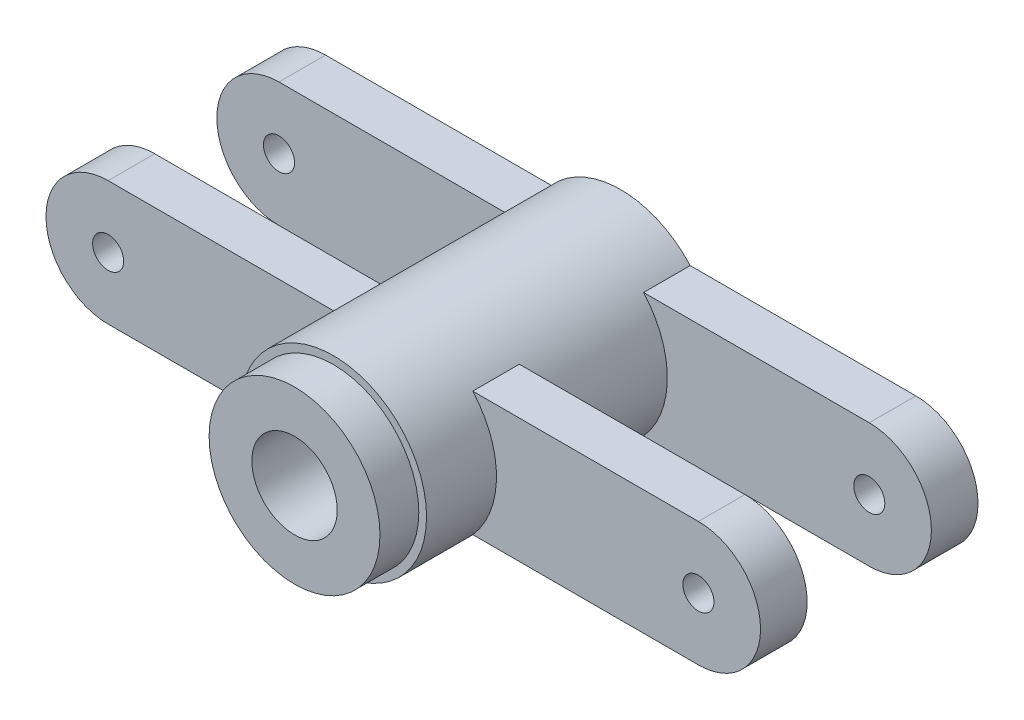
ISO-10303-21;
HEADER;
FILE_DESCRIPTION(('STEP AP214'),'2;1');
FILE_NAME('part.step','',(''),(''),'','','');
FILE_SCHEMA(('AUTOMOTIVE_DESIGN { 1 0 10303 214 1 1 1 1 }'));
ENDSEC;
DATA;
#1=APPLICATION_CONTEXT('core data for automotive mechanical design processes');
#2=APPLICATION_PROTOCOL_DEFINITION('international standard','automotive_design',2000,#1);
#3=PRODUCT_CONTEXT('',#1,'mechanical');
#4=PRODUCT('Part','Part','',(#3));
#5=PRODUCT_RELATED_PRODUCT_CATEGORY('part','',(#4));
#6=PRODUCT_DEFINITION_FORMATION('','',#4);
#7=PRODUCT_DEFINITION_CONTEXT('part definition',#1,'design');
#8=PRODUCT_DEFINITION('design','',#6,#7);
#9=PRODUCT_DEFINITION_SHAPE('','',#8);
#10=(LENGTH_UNIT() NAMED_UNIT(*) SI_UNIT(.MILLI.,.METRE.));
#11=(NAMED_UNIT(*) PLANE_ANGLE_UNIT() SI_UNIT($,.RADIAN.));
#12=(NAMED_UNIT(*) SI_UNIT($,.STERADIAN.) SOLID_ANGLE_UNIT());
#13=UNCERTAINTY_MEASURE_WITH_UNIT(LENGTH_MEASURE(1.E-05),#10,'distance_accuracy_value','');
#14=(GEOMETRIC_REPRESENTATION_CONTEXT(3) GLOBAL_UNCERTAINTY_ASSIGNED_CONTEXT((#13)) GLOBAL_UNIT_ASSIGNED_CONTEXT((#10,
#11,#12)) REPRESENTATION_CONTEXT('',''));
#15=CARTESIAN_POINT('',(0.,0.,0.));
#16=DIRECTION('',(0.,0.,1.));
#17=DIRECTION('',(1.,0.,0.));
#18=AXIS2_PLACEMENT_3D('',#15,#16,#17);
#19=CARTESIAN_POINT('',(0.,0.,21.));
#20=DIRECTION('',(0.,0.,-1.));
#21=DIRECTION('',(-1.,0.,0.));
#22=AXIS2_PLACEMENT_3D('',#19,#20,#21);
#23=CYLINDRICAL_SURFACE('',#22,1.5);
#24=CARTESIAN_POINT('',(0.,0.,0.));
#25=DIRECTION('',(0.,0.,-1.));
#26=DIRECTION('',(-1.,0.,0.));
#27=AXIS2_PLACEMENT_3D('',#24,#25,#26);
#28=CIRCLE('',#27,1.5);
#29=CARTESIAN_POINT('',(-1.5,0.,0.));
#30=VERTEX_POINT('',#29);
#31=EDGE_CURVE('E157',#30,#30,#28,.T.);
#32=ORIENTED_EDGE('',*,*,#31,.T.);
#33=EDGE_LOOP('',(#32));
#34=FACE_BOUND('',#33,.T.);
#35=CARTESIAN_POINT('',(0.,0.,16.));
#36=DIRECTION('',(0.,0.,1.));
#37=DIRECTION('',(1.,0.,0.));
#38=AXIS2_PLACEMENT_3D('',#35,#36,#37);
#39=CIRCLE('',#38,1.5);
#40=CARTESIAN_POINT('',(1.5,0.,16.));
#41=VERTEX_POINT('',#40);
#42=EDGE_CURVE('E38',#41,#41,#39,.F.);
#43=ORIENTED_EDGE('',*,*,#42,.F.);
#44=EDGE_LOOP('',(#43));
#45=FACE_BOUND('',#44,.T.);
#46=ADVANCED_FACE('F34',(#34,#45),#23,.F.);
#47=CARTESIAN_POINT('',(0.,0.,11.));
#48=DIRECTION('',(0.,0.,-1.));
#49=DIRECTION('',(-1.,0.,0.));
#50=AXIS2_PLACEMENT_3D('',#47,#48,#49);
#51=CYLINDRICAL_SURFACE('',#50,6.);
#52=DIRECTION('',(0.,0.,-1.));
#53=VECTOR('',#52,1.);
#54=CARTESIAN_POINT('',(-4.47213595499958,-4.,11.));
#55=LINE('',#54,#53);
#56=CARTESIAN_POINT('',(-4.47213595499958,-4.,0.));
#57=VERTEX_POINT('',#56);
#58=CARTESIAN_POINT('',(-4.47213595499958,-4.,3.));
#59=VERTEX_POINT('',#58);
#60=EDGE_CURVE('E237',#57,#59,#55,.F.);
#61=ORIENTED_EDGE('',*,*,#60,.F.);
#62=CARTESIAN_POINT('',(0.,0.,0.));
#63=DIRECTION('',(0.,0.,1.));
#64=DIRECTION('',(1.,0.,0.));
#65=AXIS2_PLACEMENT_3D('',#62,#63,#64);
#66=CIRCLE('',#65,6.);
#67=CARTESIAN_POINT('',(4.47213595499958,-4.,0.));
#68=VERTEX_POINT('',#67);
#69=EDGE_CURVE('E241',#57,#68,#66,.T.);
#70=ORIENTED_EDGE('',*,*,#69,.T.);
#71=DIRECTION('',(0.,0.,-1.));
#72=VECTOR('',#71,1.);
#73=CARTESIAN_POINT('',(4.47213595499958,-4.,11.));
#74=LINE('',#73,#72);
#75=CARTESIAN_POINT('',(4.47213595499958,-4.,3.));
#76=VERTEX_POINT('',#75);
#77=EDGE_CURVE('E239',#76,#68,#74,.T.);
#78=ORIENTED_EDGE('',*,*,#77,.F.);
#79=CARTESIAN_POINT('',(0.,0.,3.));
#80=DIRECTION('',(0.,0.,1.));
#81=DIRECTION('',(1.,0.,0.));
#82=AXIS2_PLACEMENT_3D('',#79,#80,#81);
#83=CIRCLE('',#82,6.);
#84=CARTESIAN_POINT('',(4.47213595499958,4.,3.));
#85=VERTEX_POINT('',#84);
#86=EDGE_CURVE('E244',#76,#85,#83,.T.);
#87=ORIENTED_EDGE('',*,*,#86,.T.);
#88=DIRECTION('',(0.,0.,-1.));
#89=VECTOR('',#88,1.);
#90=CARTESIAN_POINT('',(4.47213595499958,4.,11.));
#91=LINE('',#90,#89);
#92=CARTESIAN_POINT('',(4.47213595499958,4.,0.));
#93=VERTEX_POINT('',#92);
#94=EDGE_CURVE('E231',#93,#85,#91,.F.);
#95=ORIENTED_EDGE('',*,*,#94,.F.);
#96=CARTESIAN_POINT('',(-4.47213595499958,4.,0.));
#97=VERTEX_POINT('',#96);
#98=EDGE_CURVE('E166',#93,#97,#66,.T.);
#99=ORIENTED_EDGE('',*,*,#98,.T.);
#100=DIRECTION('',(0.,0.,-1.));
#101=VECTOR('',#100,1.);
#102=CARTESIAN_POINT('',(-4.47213595499958,4.,11.));
#103=LINE('',#102,#101);
#104=CARTESIAN_POINT('',(-4.47213595499958,4.,3.));
#105=VERTEX_POINT('',#104);
#106=EDGE_CURVE('E234',#105,#97,#103,.T.);
#107=ORIENTED_EDGE('',*,*,#106,.F.);
#108=EDGE_CURVE('E59',#105,#59,#83,.T.);
#109=ORIENTED_EDGE('',*,*,#108,.T.);
#110=EDGE_LOOP('',(#61,#70,#78,#87,#95,#99,#107,#109));
#111=FACE_BOUND('',#110,.T.);
#112=DIRECTION('',(0.,0.,-1.));
#113=VECTOR('',#112,1.);
#114=CARTESIAN_POINT('',(4.47213595499958,4.,21.));
#115=LINE('',#114,#113);
#116=CARTESIAN_POINT('',(4.47213595499958,4.,14.));
#117=VERTEX_POINT('',#116);
#118=CARTESIAN_POINT('',(4.47213595499958,4.,11.));
#119=VERTEX_POINT('',#118);
#120=EDGE_CURVE('E148',#117,#119,#115,.T.);
#121=ORIENTED_EDGE('',*,*,#120,.T.);
#122=CARTESIAN_POINT('',(0.,0.,11.));
#123=DIRECTION('',(0.,0.,1.));
#124=DIRECTION('',(1.,0.,0.));
#125=AXIS2_PLACEMENT_3D('',#122,#123,#124);
#126=CIRCLE('',#125,6.);
#127=CARTESIAN_POINT('',(4.47213595499958,-4.,11.));
#128=VERTEX_POINT('',#127);
#129=EDGE_CURVE('E151',#128,#119,#126,.T.);
#130=ORIENTED_EDGE('',*,*,#129,.F.);
#131=DIRECTION('',(0.,0.,-1.));
#132=VECTOR('',#131,1.);
#133=CARTESIAN_POINT('',(4.47213595499958,-4.,21.));
#134=LINE('',#133,#132);
#135=CARTESIAN_POINT('',(4.47213595499958,-4.,14.));
#136=VERTEX_POINT('',#135);
#137=EDGE_CURVE('E51',#128,#136,#134,.F.);
#138=ORIENTED_EDGE('',*,*,#137,.T.);
#139=CARTESIAN_POINT('',(0.,0.,14.));
#140=DIRECTION('',(0.,0.,1.));
#141=DIRECTION('',(1.,0.,0.));
#142=AXIS2_PLACEMENT_3D('',#139,#140,#141);
#143=CIRCLE('',#142,6.);
#144=EDGE_CURVE('E43',#117,#136,#143,.F.);
#145=ORIENTED_EDGE('',*,*,#144,.F.);
#146=EDGE_LOOP('',(#121,#130,#138,#145));
#147=FACE_BOUND('',#146,.T.);
#148=CARTESIAN_POINT('',(-4.47213595499958,4.,11.));
#149=VERTEX_POINT('',#148);
#150=CARTESIAN_POINT('',(-4.47213595499958,-4.,11.));
#151=VERTEX_POINT('',#150);
#152=EDGE_CURVE('E165',#149,#151,#126,.T.);
#153=ORIENTED_EDGE('',*,*,#152,.F.);
#154=DIRECTION('',(0.,0.,-1.));
#155=VECTOR('',#154,1.);
#156=CARTESIAN_POINT('',(-4.47213595499958,4.,21.));
#157=LINE('',#156,#155);
#158=CARTESIAN_POINT('',(-4.47213595499958,4.,14.));
#159=VERTEX_POINT('',#158);
#160=EDGE_CURVE('E276',#149,#159,#157,.F.);
#161=ORIENTED_EDGE('',*,*,#160,.T.);
#162=CARTESIAN_POINT('',(-4.47213595499958,-4.,14.));
#163=VERTEX_POINT('',#162);
#164=EDGE_CURVE('E11',#163,#159,#143,.F.);
#165=ORIENTED_EDGE('',*,*,#164,.F.);
#166=DIRECTION('',(0.,0.,-1.));
#167=VECTOR('',#166,1.);
#168=CARTESIAN_POINT('',(-4.47213595499958,-4.,21.));
#169=LINE('',#168,#167);
#170=EDGE_CURVE('E278',#163,#151,#169,.T.);
#171=ORIENTED_EDGE('',*,*,#170,.T.);
#172=EDGE_LOOP('',(#153,#161,#165,#171));
#173=FACE_BOUND('',#172,.T.);
#174=CARTESIAN_POINT('',(0.,0.,18.5));
#175=DIRECTION('',(0.,0.,1.));
#176=DIRECTION('',(1.,0.,0.));
#177=AXIS2_PLACEMENT_3D('',#174,#175,#176);
#178=CIRCLE('',#177,6.);
#179=CARTESIAN_POINT('',(6.,0.,18.5));
#180=VERTEX_POINT('',#179);
#181=EDGE_CURVE('E268',#180,#180,#178,.T.);
#182=ORIENTED_EDGE('',*,*,#181,.F.);
#183=EDGE_LOOP('',(#182));
#184=FACE_BOUND('',#183,.T.);
#185=ADVANCED_FACE('F36',(#111,#147,#173,#184),#51,.T.);
#186=CARTESIAN_POINT('',(0.,0.,21.));
#187=DIRECTION('',(0.,0.,1.));
#188=DIRECTION('',(1.,0.,0.));
#189=AXIS2_PLACEMENT_3D('',#186,#187,#188);
#190=PLANE('',#189);
#191=CARTESIAN_POINT('',(0.,0.,21.));
#192=DIRECTION('',(0.,0.,1.));
#193=DIRECTION('',(1.,0.,0.));
#194=AXIS2_PLACEMENT_3D('',#191,#192,#193);
#195=CIRCLE('',#194,2.75);
#196=CARTESIAN_POINT('',(2.75,0.,21.));
#197=VERTEX_POINT('',#196);
#198=EDGE_CURVE('E345',#197,#197,#195,.T.);
#199=ORIENTED_EDGE('',*,*,#198,.F.);
#200=EDGE_LOOP('',(#199));
#201=FACE_BOUND('',#200,.T.);
#202=CARTESIAN_POINT('',(0.,0.,21.));
#203=DIRECTION('',(0.,0.,1.));
#204=DIRECTION('',(1.,0.,0.));
#205=AXIS2_PLACEMENT_3D('',#202,#203,#204);
#206=CIRCLE('',#205,5.5);
#207=CARTESIAN_POINT('',(5.5,0.,21.));
#208=VERTEX_POINT('',#207);
#209=EDGE_CURVE('E252',#208,#208,#206,.T.);
#210=ORIENTED_EDGE('',*,*,#209,.T.);
#211=EDGE_LOOP('',(#210));
#212=FACE_BOUND('',#211,.T.);
#213=ADVANCED_FACE('F332',(#201,#212),#190,.T.);
#214=CARTESIAN_POINT('',(-19.,-4.,14.));
#215=DIRECTION('',(0.,1.,0.));
#216=DIRECTION('',(-1.,0.,0.));
#217=AXIS2_PLACEMENT_3D('',#214,#215,#216);
#218=PLANE('',#217);
#219=ORIENTED_EDGE('',*,*,#137,.F.);
#220=DIRECTION('',(1.,0.,0.));
#221=VECTOR('',#220,1.);
#222=CARTESIAN_POINT('',(-19.,-4.,11.));
#223=LINE('',#222,#221);
#224=CARTESIAN_POINT('',(19.,-4.,11.));
#225=VERTEX_POINT('',#224);
#226=EDGE_CURVE('E164',#128,#225,#223,.T.);
#227=ORIENTED_EDGE('',*,*,#226,.T.);
#228=DIRECTION('',(0.,0.,-1.));
#229=VECTOR('',#228,1.);
#230=CARTESIAN_POINT('',(19.,-4.,14.));
#231=LINE('',#230,#229);
#232=CARTESIAN_POINT('',(19.,-4.,14.));
#233=VERTEX_POINT('',#232);
#234=EDGE_CURVE('E187',#233,#225,#231,.T.);
#235=ORIENTED_EDGE('',*,*,#234,.F.);
#236=DIRECTION('',(1.,0.,0.));
#237=VECTOR('',#236,1.);
#238=CARTESIAN_POINT('',(-19.,-4.,14.));
#239=LINE('',#238,#237);
#240=EDGE_CURVE('E176',#136,#233,#239,.T.);
#241=ORIENTED_EDGE('',*,*,#240,.F.);
#242=EDGE_LOOP('',(#219,#227,#235,#241));
#243=FACE_BOUND('',#242,.T.);
#244=ADVANCED_FACE('F295',(#243),#218,.F.);
#245=ORIENTED_EDGE('',*,*,#170,.F.);
#246=CARTESIAN_POINT('',(-19.,-4.,14.));
#247=VERTEX_POINT('',#246);
#248=EDGE_CURVE('E281',#247,#163,#239,.T.);
#249=ORIENTED_EDGE('',*,*,#248,.F.);
#250=DIRECTION('',(0.,0.,-1.));
#251=VECTOR('',#250,1.);
#252=CARTESIAN_POINT('',(-19.,-4.,14.));
#253=LINE('',#252,#251);
#254=CARTESIAN_POINT('',(-19.,-4.,11.));
#255=VERTEX_POINT('',#254);
#256=EDGE_CURVE('E190',#247,#255,#253,.T.);
#257=ORIENTED_EDGE('',*,*,#256,.T.);
#258=EDGE_CURVE('E289',#255,#151,#223,.T.);
#259=ORIENTED_EDGE('',*,*,#258,.T.);
#260=EDGE_LOOP('',(#245,#249,#257,#259));
#261=FACE_BOUND('',#260,.T.);
#262=ADVANCED_FACE('F340',(#261),#218,.F.);
#263=CARTESIAN_POINT('',(-19.,4.,14.));
#264=DIRECTION('',(0.,-1.,0.));
#265=DIRECTION('',(1.,0.,0.));
#266=AXIS2_PLACEMENT_3D('',#263,#264,#265);
#267=PLANE('',#266);
#268=ORIENTED_EDGE('',*,*,#160,.F.);
#269=DIRECTION('',(-1.,0.,0.));
#270=VECTOR('',#269,1.);
#271=CARTESIAN_POINT('',(-19.,4.,11.));
#272=LINE('',#271,#270);
#273=CARTESIAN_POINT('',(-19.,4.,11.));
#274=VERTEX_POINT('',#273);
#275=EDGE_CURVE('E173',#149,#274,#272,.T.);
#276=ORIENTED_EDGE('',*,*,#275,.T.);
#277=DIRECTION('',(0.,0.,-1.));
#278=VECTOR('',#277,1.);
#279=CARTESIAN_POINT('',(-19.,4.,14.));
#280=LINE('',#279,#278);
#281=CARTESIAN_POINT('',(-19.,4.,14.));
#282=VERTEX_POINT('',#281);
#283=EDGE_CURVE('E182',#282,#274,#280,.T.);
#284=ORIENTED_EDGE('',*,*,#283,.F.);
#285=DIRECTION('',(-1.,0.,0.));
#286=VECTOR('',#285,1.);
#287=CARTESIAN_POINT('',(-19.,4.,14.));
#288=LINE('',#287,#286);
#289=EDGE_CURVE('E286',#159,#282,#288,.T.);
#290=ORIENTED_EDGE('',*,*,#289,.F.);
#291=EDGE_LOOP('',(#268,#276,#284,#290));
#292=FACE_BOUND('',#291,.T.);
#293=ADVANCED_FACE('F465',(#292),#267,.F.);
#294=ORIENTED_EDGE('',*,*,#120,.F.);
#295=CARTESIAN_POINT('',(19.,4.,14.));
#296=VERTEX_POINT('',#295);
#297=EDGE_CURVE('E185',#296,#117,#288,.T.);
#298=ORIENTED_EDGE('',*,*,#297,.F.);
#299=DIRECTION('',(0.,0.,-1.));
#300=VECTOR('',#299,1.);
#301=CARTESIAN_POINT('',(19.,4.,14.));
#302=LINE('',#301,#300);
#303=CARTESIAN_POINT('',(19.,4.,11.));
#304=VERTEX_POINT('',#303);
#305=EDGE_CURVE('E171',#296,#304,#302,.T.);
#306=ORIENTED_EDGE('',*,*,#305,.T.);
#307=EDGE_CURVE('E163',#304,#119,#272,.T.);
#308=ORIENTED_EDGE('',*,*,#307,.T.);
#309=EDGE_LOOP('',(#294,#298,#306,#308));
#310=FACE_BOUND('',#309,.T.);
#311=ADVANCED_FACE('F169',(#310),#267,.F.);
#312=CARTESIAN_POINT('',(-19.,0.,14.));
#313=DIRECTION('',(0.,0.,1.));
#314=DIRECTION('',(1.,0.,0.));
#315=AXIS2_PLACEMENT_3D('',#312,#313,#314);
#316=PLANE('',#315);
#317=CARTESIAN_POINT('',(-19.,0.,14.));
#318=DIRECTION('',(0.,0.,1.));
#319=DIRECTION('',(1.,0.,0.));
#320=AXIS2_PLACEMENT_3D('',#317,#318,#319);
#321=CIRCLE('',#320,1.);
#322=CARTESIAN_POINT('',(-18.,0.,14.));
#323=VERTEX_POINT('',#322);
#324=EDGE_CURVE('E255',#323,#323,#321,.T.);
#325=ORIENTED_EDGE('',*,*,#324,.F.);
#326=EDGE_LOOP('',(#325));
#327=FACE_BOUND('',#326,.T.);
#328=ORIENTED_EDGE('',*,*,#248,.T.);
#329=ORIENTED_EDGE('',*,*,#164,.T.);
#330=ORIENTED_EDGE('',*,*,#289,.T.);
#331=CARTESIAN_POINT('',(-19.,0.,14.));
#332=DIRECTION('',(0.,0.,1.));
#333=DIRECTION('',(1.,0.,0.));
#334=AXIS2_PLACEMENT_3D('',#331,#332,#333);
#335=CIRCLE('',#334,4.);
#336=EDGE_CURVE('E172',#282,#247,#335,.T.);
#337=ORIENTED_EDGE('',*,*,#336,.T.);
#338=EDGE_LOOP('',(#328,#329,#330,#337));
#339=FACE_BOUND('',#338,.T.);
#340=ADVANCED_FACE('F306',(#327,#339),#316,.T.);
#341=CARTESIAN_POINT('',(0.,0.,0.));
#342=DIRECTION('',(0.,0.,1.));
#343=DIRECTION('',(1.,0.,0.));
#344=AXIS2_PLACEMENT_3D('',#341,#342,#343);
#345=PLANE('',#344);
#346=CARTESIAN_POINT('',(19.,0.,0.));
#347=DIRECTION('',(0.,0.,1.));
#348=DIRECTION('',(1.,0.,0.));
#349=AXIS2_PLACEMENT_3D('',#346,#347,#348);
#350=CIRCLE('',#349,1.);
#351=CARTESIAN_POINT('',(20.,0.,0.));
#352=VERTEX_POINT('',#351);
#353=EDGE_CURVE('E381',#352,#352,#350,.T.);
#354=ORIENTED_EDGE('',*,*,#353,.T.);
#355=EDGE_LOOP('',(#354));
#356=FACE_BOUND('',#355,.T.);
#357=CARTESIAN_POINT('',(-19.,0.,0.));
#358=DIRECTION('',(0.,0.,1.));
#359=DIRECTION('',(1.,0.,0.));
#360=AXIS2_PLACEMENT_3D('',#357,#358,#359);
#361=CIRCLE('',#360,1.);
#362=CARTESIAN_POINT('',(-18.,0.,0.));
#363=VERTEX_POINT('',#362);
#364=EDGE_CURVE('E248',#363,#363,#361,.T.);
#365=ORIENTED_EDGE('',*,*,#364,.T.);
#366=EDGE_LOOP('',(#365));
#367=FACE_BOUND('',#366,.T.);
#368=ORIENTED_EDGE('',*,*,#31,.F.);
#369=EDGE_LOOP('',(#368));
#370=FACE_BOUND('',#369,.T.);
#371=ORIENTED_EDGE('',*,*,#98,.F.);
#372=DIRECTION('',(-1.,0.,0.));
#373=VECTOR('',#372,1.);
#374=CARTESIAN_POINT('',(-19.,4.,0.));
#375=LINE('',#374,#373);
#376=CARTESIAN_POINT('',(19.,4.,0.));
#377=VERTEX_POINT('',#376);
#378=EDGE_CURVE('E198',#377,#93,#375,.T.);
#379=ORIENTED_EDGE('',*,*,#378,.F.);
#380=CARTESIAN_POINT('',(19.,0.,0.));
#381=DIRECTION('',(0.,0.,1.));
#382=DIRECTION('',(1.,0.,0.));
#383=AXIS2_PLACEMENT_3D('',#380,#381,#382);
#384=CIRCLE('',#383,4.);
#385=CARTESIAN_POINT('',(19.,-4.,0.));
#386=VERTEX_POINT('',#385);
#387=EDGE_CURVE('E215',#386,#377,#384,.T.);
#388=ORIENTED_EDGE('',*,*,#387,.F.);
#389=DIRECTION('',(1.,0.,0.));
#390=VECTOR('',#389,1.);
#391=CARTESIAN_POINT('',(-19.,-4.,0.));
#392=LINE('',#391,#390);
#393=EDGE_CURVE('E211',#68,#386,#392,.T.);
#394=ORIENTED_EDGE('',*,*,#393,.F.);
#395=ORIENTED_EDGE('',*,*,#69,.F.);
#396=CARTESIAN_POINT('',(-19.,-4.,0.));
#397=VERTEX_POINT('',#396);
#398=EDGE_CURVE('E212',#397,#57,#392,.T.);
#399=ORIENTED_EDGE('',*,*,#398,.F.);
#400=CARTESIAN_POINT('',(-19.,0.,0.));
#401=DIRECTION('',(0.,0.,1.));
#402=DIRECTION('',(1.,0.,0.));
#403=AXIS2_PLACEMENT_3D('',#400,#401,#402);
#404=CIRCLE('',#403,4.);
#405=CARTESIAN_POINT('',(-19.,4.,0.));
#406=VERTEX_POINT('',#405);
#407=EDGE_CURVE('E193',#406,#397,#404,.T.);
#408=ORIENTED_EDGE('',*,*,#407,.F.);
#409=EDGE_CURVE('E217',#97,#406,#375,.T.);
#410=ORIENTED_EDGE('',*,*,#409,.F.);
#411=EDGE_LOOP('',(#371,#379,#388,#394,#395,#399,#408,#410));
#412=FACE_BOUND('',#411,.T.);
#413=ADVANCED_FACE('F322',(#356,#367,#370,#412),#345,.F.);
#414=CARTESIAN_POINT('',(19.,0.,3.));
#415=DIRECTION('',(0.,0.,-1.));
#416=DIRECTION('',(-1.,0.,0.));
#417=AXIS2_PLACEMENT_3D('',#414,#415,#416);
#418=CYLINDRICAL_SURFACE('',#417,4.);
#419=ORIENTED_EDGE('',*,*,#387,.T.);
#420=DIRECTION('',(0.,0.,-1.));
#421=VECTOR('',#420,1.);
#422=CARTESIAN_POINT('',(19.,4.,3.));
#423=LINE('',#422,#421);
#424=CARTESIAN_POINT('',(19.,4.,3.));
#425=VERTEX_POINT('',#424);
#426=EDGE_CURVE('E222',#425,#377,#423,.T.);
#427=ORIENTED_EDGE('',*,*,#426,.F.);
#428=CARTESIAN_POINT('',(19.,0.,3.));
#429=DIRECTION('',(0.,0.,1.));
#430=DIRECTION('',(1.,0.,0.));
#431=AXIS2_PLACEMENT_3D('',#428,#429,#430);
#432=CIRCLE('',#431,4.);
#433=CARTESIAN_POINT('',(19.,-4.,3.));
#434=VERTEX_POINT('',#433);
#435=EDGE_CURVE('E202',#434,#425,#432,.T.);
#436=ORIENTED_EDGE('',*,*,#435,.F.);
#437=DIRECTION('',(0.,0.,-1.));
#438=VECTOR('',#437,1.);
#439=CARTESIAN_POINT('',(19.,-4.,3.));
#440=LINE('',#439,#438);
#441=EDGE_CURVE('E225',#434,#386,#440,.T.);
#442=ORIENTED_EDGE('',*,*,#441,.T.);
#443=EDGE_LOOP('',(#419,#427,#436,#442));
#444=FACE_BOUND('',#443,.T.);
#445=ADVANCED_FACE('F399',(#444),#418,.T.);
#446=CARTESIAN_POINT('',(-19.,0.,3.));
#447=DIRECTION('',(0.,0.,1.));
#448=DIRECTION('',(1.,0.,0.));
#449=AXIS2_PLACEMENT_3D('',#446,#447,#448);
#450=PLANE('',#449);
#451=CARTESIAN_POINT('',(19.,0.,3.));
#452=DIRECTION('',(0.,0.,1.));
#453=DIRECTION('',(1.,0.,0.));
#454=AXIS2_PLACEMENT_3D('',#451,#452,#453);
#455=CIRCLE('',#454,1.);
#456=CARTESIAN_POINT('',(20.,0.,3.));
#457=VERTEX_POINT('',#456);
#458=EDGE_CURVE('E260',#457,#457,#455,.T.);
#459=ORIENTED_EDGE('',*,*,#458,.F.);
#460=EDGE_LOOP('',(#459));
#461=FACE_BOUND('',#460,.T.);
#462=ORIENTED_EDGE('',*,*,#86,.F.);
#463=DIRECTION('',(1.,0.,0.));
#464=VECTOR('',#463,1.);
#465=CARTESIAN_POINT('',(-19.,-4.,3.));
#466=LINE('',#465,#464);
#467=EDGE_CURVE('E197',#76,#434,#466,.T.);
#468=ORIENTED_EDGE('',*,*,#467,.T.);
#469=ORIENTED_EDGE('',*,*,#435,.T.);
#470=DIRECTION('',(-1.,0.,0.));
#471=VECTOR('',#470,1.);
#472=CARTESIAN_POINT('',(-19.,4.,3.));
#473=LINE('',#472,#471);
#474=EDGE_CURVE('E205',#425,#85,#473,.T.);
#475=ORIENTED_EDGE('',*,*,#474,.T.);
#476=EDGE_LOOP('',(#462,#468,#469,#475));
#477=FACE_BOUND('',#476,.T.);
#478=ADVANCED_FACE('F395',(#461,#477),#450,.T.);
#479=CARTESIAN_POINT('',(-19.,4.,3.));
#480=DIRECTION('',(0.,-1.,0.));
#481=DIRECTION('',(1.,0.,0.));
#482=AXIS2_PLACEMENT_3D('',#479,#480,#481);
#483=PLANE('',#482);
#484=ORIENTED_EDGE('',*,*,#378,.T.);
#485=ORIENTED_EDGE('',*,*,#94,.T.);
#486=ORIENTED_EDGE('',*,*,#474,.F.);
#487=ORIENTED_EDGE('',*,*,#426,.T.);
#488=EDGE_LOOP('',(#484,#485,#486,#487));
#489=FACE_BOUND('',#488,.T.);
#490=ADVANCED_FACE('F398',(#489),#483,.F.);
#491=CARTESIAN_POINT('',(-19.,-4.,3.));
#492=DIRECTION('',(0.,1.,0.));
#493=DIRECTION('',(-1.,0.,0.));
#494=AXIS2_PLACEMENT_3D('',#491,#492,#493);
#495=PLANE('',#494);
#496=ORIENTED_EDGE('',*,*,#467,.F.);
#497=ORIENTED_EDGE('',*,*,#77,.T.);
#498=ORIENTED_EDGE('',*,*,#393,.T.);
#499=ORIENTED_EDGE('',*,*,#441,.F.);
#500=EDGE_LOOP('',(#496,#497,#498,#499));
#501=FACE_BOUND('',#500,.T.);
#502=ADVANCED_FACE('F408',(#501),#495,.F.);
#503=CARTESIAN_POINT('',(-19.,0.,3.));
#504=DIRECTION('',(0.,0.,1.));
#505=DIRECTION('',(1.,0.,0.));
#506=AXIS2_PLACEMENT_3D('',#503,#504,#505);
#507=CIRCLE('',#506,1.);
#508=CARTESIAN_POINT('',(-18.,0.,3.));
#509=VERTEX_POINT('',#508);
#510=EDGE_CURVE('E247',#509,#509,#507,.T.);
#511=ORIENTED_EDGE('',*,*,#510,.F.);
#512=EDGE_LOOP('',(#511));
#513=FACE_BOUND('',#512,.T.);
#514=ORIENTED_EDGE('',*,*,#108,.F.);
#515=CARTESIAN_POINT('',(-19.,4.,3.));
#516=VERTEX_POINT('',#515);
#517=EDGE_CURVE('E204',#105,#516,#473,.T.);
#518=ORIENTED_EDGE('',*,*,#517,.T.);
#519=CARTESIAN_POINT('',(-19.,0.,3.));
#520=DIRECTION('',(0.,0.,1.));
#521=DIRECTION('',(1.,0.,0.));
#522=AXIS2_PLACEMENT_3D('',#519,#520,#521);
#523=CIRCLE('',#522,4.);
#524=CARTESIAN_POINT('',(-19.,-4.,3.));
#525=VERTEX_POINT('',#524);
#526=EDGE_CURVE('E194',#516,#525,#523,.T.);
#527=ORIENTED_EDGE('',*,*,#526,.T.);
#528=EDGE_CURVE('E199',#525,#59,#466,.T.);
#529=ORIENTED_EDGE('',*,*,#528,.T.);
#530=EDGE_LOOP('',(#514,#518,#527,#529));
#531=FACE_BOUND('',#530,.T.);
#532=ADVANCED_FACE('F401',(#513,#531),#450,.T.);
#533=ORIENTED_EDGE('',*,*,#398,.T.);
#534=ORIENTED_EDGE('',*,*,#60,.T.);
#535=ORIENTED_EDGE('',*,*,#528,.F.);
#536=DIRECTION('',(0.,0.,-1.));
#537=VECTOR('',#536,1.);
#538=CARTESIAN_POINT('',(-19.,-4.,3.));
#539=LINE('',#538,#537);
#540=EDGE_CURVE('E228',#525,#397,#539,.T.);
#541=ORIENTED_EDGE('',*,*,#540,.T.);
#542=EDGE_LOOP('',(#533,#534,#535,#541));
#543=FACE_BOUND('',#542,.T.);
#544=ADVANCED_FACE('F429',(#543),#495,.F.);
#545=ORIENTED_EDGE('',*,*,#517,.F.);
#546=ORIENTED_EDGE('',*,*,#106,.T.);
#547=ORIENTED_EDGE('',*,*,#409,.T.);
#548=DIRECTION('',(0.,0.,-1.));
#549=VECTOR('',#548,1.);
#550=CARTESIAN_POINT('',(-19.,4.,3.));
#551=LINE('',#550,#549);
#552=EDGE_CURVE('E208',#516,#406,#551,.T.);
#553=ORIENTED_EDGE('',*,*,#552,.F.);
#554=EDGE_LOOP('',(#545,#546,#547,#553));
#555=FACE_BOUND('',#554,.T.);
#556=ADVANCED_FACE('F420',(#555),#483,.F.);
#557=CARTESIAN_POINT('',(-19.,0.,3.));
#558=DIRECTION('',(0.,0.,-1.));
#559=DIRECTION('',(-1.,0.,0.));
#560=AXIS2_PLACEMENT_3D('',#557,#558,#559);
#561=CYLINDRICAL_SURFACE('',#560,4.);
#562=ORIENTED_EDGE('',*,*,#407,.T.);
#563=ORIENTED_EDGE('',*,*,#540,.F.);
#564=ORIENTED_EDGE('',*,*,#526,.F.);
#565=ORIENTED_EDGE('',*,*,#552,.T.);
#566=EDGE_LOOP('',(#562,#563,#564,#565));
#567=FACE_BOUND('',#566,.T.);
#568=ADVANCED_FACE('F425',(#567),#561,.T.);
#569=CARTESIAN_POINT('',(-19.,0.,11.));
#570=DIRECTION('',(0.,0.,1.));
#571=DIRECTION('',(1.,0.,0.));
#572=AXIS2_PLACEMENT_3D('',#569,#570,#571);
#573=PLANE('',#572);
#574=CARTESIAN_POINT('',(-19.,0.,11.));
#575=DIRECTION('',(0.,0.,1.));
#576=DIRECTION('',(1.,0.,0.));
#577=AXIS2_PLACEMENT_3D('',#574,#575,#576);
#578=CIRCLE('',#577,1.);
#579=CARTESIAN_POINT('',(-18.,0.,11.));
#580=VERTEX_POINT('',#579);
#581=EDGE_CURVE('E245',#580,#580,#578,.T.);
#582=ORIENTED_EDGE('',*,*,#581,.T.);
#583=EDGE_LOOP('',(#582));
#584=FACE_BOUND('',#583,.T.);
#585=ORIENTED_EDGE('',*,*,#275,.F.);
#586=ORIENTED_EDGE('',*,*,#152,.T.);
#587=ORIENTED_EDGE('',*,*,#258,.F.);
#588=CARTESIAN_POINT('',(-19.,0.,11.));
#589=DIRECTION('',(0.,0.,1.));
#590=DIRECTION('',(1.,0.,0.));
#591=AXIS2_PLACEMENT_3D('',#588,#589,#590);
#592=CIRCLE('',#591,4.);
#593=EDGE_CURVE('E279',#274,#255,#592,.T.);
#594=ORIENTED_EDGE('',*,*,#593,.F.);
#595=EDGE_LOOP('',(#585,#586,#587,#594));
#596=FACE_BOUND('',#595,.T.);
#597=ADVANCED_FACE('F457',(#584,#596),#573,.F.);
#598=CARTESIAN_POINT('',(19.,0.,11.));
#599=DIRECTION('',(0.,0.,1.));
#600=DIRECTION('',(1.,0.,0.));
#601=AXIS2_PLACEMENT_3D('',#598,#599,#600);
#602=CIRCLE('',#601,1.);
#603=CARTESIAN_POINT('',(20.,0.,11.));
#604=VERTEX_POINT('',#603);
#605=EDGE_CURVE('E387',#604,#604,#602,.T.);
#606=ORIENTED_EDGE('',*,*,#605,.T.);
#607=EDGE_LOOP('',(#606));
#608=FACE_BOUND('',#607,.T.);
#609=ORIENTED_EDGE('',*,*,#226,.F.);
#610=ORIENTED_EDGE('',*,*,#129,.T.);
#611=ORIENTED_EDGE('',*,*,#307,.F.);
#612=CARTESIAN_POINT('',(19.,0.,11.));
#613=DIRECTION('',(0.,0.,1.));
#614=DIRECTION('',(1.,0.,0.));
#615=AXIS2_PLACEMENT_3D('',#612,#613,#614);
#616=CIRCLE('',#615,4.);
#617=EDGE_CURVE('E178',#225,#304,#616,.T.);
#618=ORIENTED_EDGE('',*,*,#617,.F.);
#619=EDGE_LOOP('',(#609,#610,#611,#618));
#620=FACE_BOUND('',#619,.T.);
#621=ADVANCED_FACE('F161',(#608,#620),#573,.F.);
#622=CARTESIAN_POINT('',(-19.,0.,14.));
#623=DIRECTION('',(0.,0.,-1.));
#624=DIRECTION('',(-1.,0.,0.));
#625=AXIS2_PLACEMENT_3D('',#622,#623,#624);
#626=CYLINDRICAL_SURFACE('',#625,4.);
#627=ORIENTED_EDGE('',*,*,#593,.T.);
#628=ORIENTED_EDGE('',*,*,#256,.F.);
#629=ORIENTED_EDGE('',*,*,#336,.F.);
#630=ORIENTED_EDGE('',*,*,#283,.T.);
#631=EDGE_LOOP('',(#627,#628,#629,#630));
#632=FACE_BOUND('',#631,.T.);
#633=ADVANCED_FACE('F316',(#632),#626,.T.);
#634=CARTESIAN_POINT('',(19.,0.,14.));
#635=DIRECTION('',(0.,0.,-1.));
#636=DIRECTION('',(-1.,0.,0.));
#637=AXIS2_PLACEMENT_3D('',#634,#635,#636);
#638=CYLINDRICAL_SURFACE('',#637,4.);
#639=ORIENTED_EDGE('',*,*,#617,.T.);
#640=ORIENTED_EDGE('',*,*,#305,.F.);
#641=CARTESIAN_POINT('',(19.,0.,14.));
#642=DIRECTION('',(0.,0.,1.));
#643=DIRECTION('',(1.,0.,0.));
#644=AXIS2_PLACEMENT_3D('',#641,#642,#643);
#645=CIRCLE('',#644,4.);
#646=EDGE_CURVE('E284',#233,#296,#645,.T.);
#647=ORIENTED_EDGE('',*,*,#646,.F.);
#648=ORIENTED_EDGE('',*,*,#234,.T.);
#649=EDGE_LOOP('',(#639,#640,#647,#648));
#650=FACE_BOUND('',#649,.T.);
#651=ADVANCED_FACE('F299',(#650),#638,.T.);
#652=CARTESIAN_POINT('',(19.,0.,14.));
#653=DIRECTION('',(0.,0.,1.));
#654=DIRECTION('',(1.,0.,0.));
#655=AXIS2_PLACEMENT_3D('',#652,#653,#654);
#656=CIRCLE('',#655,1.);
#657=CARTESIAN_POINT('',(20.,0.,14.));
#658=VERTEX_POINT('',#657);
#659=EDGE_CURVE('E379',#658,#658,#656,.T.);
#660=ORIENTED_EDGE('',*,*,#659,.F.);
#661=EDGE_LOOP('',(#660));
#662=FACE_BOUND('',#661,.T.);
#663=ORIENTED_EDGE('',*,*,#297,.T.);
#664=ORIENTED_EDGE('',*,*,#144,.T.);
#665=ORIENTED_EDGE('',*,*,#240,.T.);
#666=ORIENTED_EDGE('',*,*,#646,.T.);
#667=EDGE_LOOP('',(#663,#664,#665,#666));
#668=FACE_BOUND('',#667,.T.);
#669=ADVANCED_FACE('F301',(#662,#668),#316,.T.);
#670=CARTESIAN_POINT('',(0.,0.,18.5));
#671=DIRECTION('',(0.,0.,1.));
#672=DIRECTION('',(1.,0.,0.));
#673=AXIS2_PLACEMENT_3D('',#670,#671,#672);
#674=PLANE('',#673);
#675=CARTESIAN_POINT('',(0.,0.,18.5));
#676=DIRECTION('',(0.,0.,1.));
#677=DIRECTION('',(1.,0.,0.));
#678=AXIS2_PLACEMENT_3D('',#675,#676,#677);
#679=CIRCLE('',#678,5.5);
#680=CARTESIAN_POINT('',(5.5,0.,18.5));
#681=VERTEX_POINT('',#680);
#682=EDGE_CURVE('E265',#681,#681,#679,.T.);
#683=ORIENTED_EDGE('',*,*,#682,.F.);
#684=EDGE_LOOP('',(#683));
#685=FACE_BOUND('',#684,.T.);
#686=ORIENTED_EDGE('',*,*,#181,.T.);
#687=EDGE_LOOP('',(#686));
#688=FACE_BOUND('',#687,.T.);
#689=ADVANCED_FACE('F303',(#685,#688),#674,.T.);
#690=CARTESIAN_POINT('',(0.,0.,18.5));
#691=DIRECTION('',(0.,0.,1.));
#692=DIRECTION('',(1.,0.,0.));
#693=AXIS2_PLACEMENT_3D('',#690,#691,#692);
#694=CYLINDRICAL_SURFACE('',#693,5.5);
#695=ORIENTED_EDGE('',*,*,#682,.T.);
#696=EDGE_LOOP('',(#695));
#697=FACE_BOUND('',#696,.T.);
#698=ORIENTED_EDGE('',*,*,#209,.F.);
#699=EDGE_LOOP('',(#698));
#700=FACE_BOUND('',#699,.T.);
#701=ADVANCED_FACE('F312',(#697,#700),#694,.T.);
#702=CARTESIAN_POINT('',(-19.,0.,0.));
#703=DIRECTION('',(0.,0.,1.));
#704=DIRECTION('',(1.,0.,0.));
#705=AXIS2_PLACEMENT_3D('',#702,#703,#704);
#706=CYLINDRICAL_SURFACE('',#705,1.);
#707=CARTESIAN_POINT('',(-18.,0.,14.));
#708=CARTESIAN_POINT('',(-18.,0.,13.96875));
#709=CARTESIAN_POINT('',(-18.,0.,13.9375));
#710=CARTESIAN_POINT('',(-18.,0.,13.875));
#711=CARTESIAN_POINT('',(-18.,0.,13.84375));
#712=CARTESIAN_POINT('',(-18.,0.,13.78125));
#713=CARTESIAN_POINT('',(-18.,0.,13.75));
#714=CARTESIAN_POINT('',(-18.,0.,13.6875));
#715=CARTESIAN_POINT('',(-18.,0.,13.65625));
#716=CARTESIAN_POINT('',(-18.,0.,13.59375));
#717=CARTESIAN_POINT('',(-18.,0.,13.5625));
#718=CARTESIAN_POINT('',(-18.,0.,13.5));
#719=CARTESIAN_POINT('',(-18.,0.,13.46875));
#720=CARTESIAN_POINT('',(-18.,0.,13.40625));
#721=CARTESIAN_POINT('',(-18.,0.,13.375));
#722=CARTESIAN_POINT('',(-18.,0.,13.3125));
#723=CARTESIAN_POINT('',(-18.,0.,13.28125));
#724=CARTESIAN_POINT('',(-18.,0.,13.21875));
#725=CARTESIAN_POINT('',(-18.,0.,13.1875));
#726=CARTESIAN_POINT('',(-18.,0.,13.125));
#727=CARTESIAN_POINT('',(-18.,0.,13.09375));
#728=CARTESIAN_POINT('',(-18.,0.,13.03125));
#729=CARTESIAN_POINT('',(-18.,0.,13.));
#730=CARTESIAN_POINT('',(-18.,0.,12.9375));
#731=CARTESIAN_POINT('',(-18.,0.,12.90625));
#732=CARTESIAN_POINT('',(-18.,0.,12.84375));
#733=CARTESIAN_POINT('',(-18.,0.,12.8125));
#734=CARTESIAN_POINT('',(-18.,0.,12.75));
#735=CARTESIAN_POINT('',(-18.,0.,12.71875));
#736=CARTESIAN_POINT('',(-18.,0.,12.65625));
#737=CARTESIAN_POINT('',(-18.,0.,12.625));
#738=CARTESIAN_POINT('',(-18.,0.,12.5625));
#739=CARTESIAN_POINT('',(-18.,0.,12.53125));
#740=CARTESIAN_POINT('',(-18.,0.,12.46875));
#741=CARTESIAN_POINT('',(-18.,0.,12.4375));
#742=CARTESIAN_POINT('',(-18.,0.,12.375));
#743=CARTESIAN_POINT('',(-18.,0.,12.34375));
#744=CARTESIAN_POINT('',(-18.,0.,12.28125));
#745=CARTESIAN_POINT('',(-18.,0.,12.25));
#746=CARTESIAN_POINT('',(-18.,0.,12.1875));
#747=CARTESIAN_POINT('',(-18.,0.,12.15625));
#748=CARTESIAN_POINT('',(-18.,0.,12.09375));
#749=CARTESIAN_POINT('',(-18.,0.,12.0625));
#750=CARTESIAN_POINT('',(-18.,0.,12.));
#751=CARTESIAN_POINT('',(-18.,0.,11.96875));
#752=CARTESIAN_POINT('',(-18.,0.,11.90625));
#753=CARTESIAN_POINT('',(-18.,0.,11.875));
#754=CARTESIAN_POINT('',(-18.,0.,11.8125));
#755=CARTESIAN_POINT('',(-18.,0.,11.78125));
#756=CARTESIAN_POINT('',(-18.,0.,11.71875));
#757=CARTESIAN_POINT('',(-18.,0.,11.6875));
#758=CARTESIAN_POINT('',(-18.,0.,11.625));
#759=CARTESIAN_POINT('',(-18.,0.,11.59375));
#760=CARTESIAN_POINT('',(-18.,0.,11.53125));
#761=CARTESIAN_POINT('',(-18.,0.,11.5));
#762=CARTESIAN_POINT('',(-18.,0.,11.4375));
#763=CARTESIAN_POINT('',(-18.,0.,11.40625));
#764=CARTESIAN_POINT('',(-18.,0.,11.34375));
#765=CARTESIAN_POINT('',(-18.,0.,11.3125));
#766=CARTESIAN_POINT('',(-18.,0.,11.25));
#767=CARTESIAN_POINT('',(-18.,0.,11.21875));
#768=CARTESIAN_POINT('',(-18.,0.,11.15625));
#769=CARTESIAN_POINT('',(-18.,0.,11.125));
#770=CARTESIAN_POINT('',(-18.,0.,11.0625));
#771=CARTESIAN_POINT('',(-18.,0.,11.03125));
#772=CARTESIAN_POINT('',(-18.,0.,11.));
#773=B_SPLINE_CURVE_WITH_KNOTS('',3,(#707,#708,#709,#710,#711,#712,#713,#714,#715,#716,#717,
#718,#719,#720,#721,#722,#723,#724,#725,#726,#727,#728,#729,#730,#731,#732,#733,#734,#735,#736,
#737,#738,#739,#740,#741,#742,#743,#744,#745,#746,#747,#748,#749,#750,#751,#752,#753,#754,#755,
#756,#757,#758,#759,#760,#761,#762,#763,#764,#765,#766,#767,#768,#769,#770,#771,#772),
.UNSPECIFIED.,.F.,.F.,(4,2,2,2,2,2,2,2,2,2,2,2,2,2,2,2,2,2,2,2,2,2,2,2,2,2,2,2,2,2,2,2,4),(0.,
0.0937500000000001,0.1875,0.28125,0.375,0.46875,0.5625,0.656250000000001,0.750000000000001,
0.843749999999999,0.937499999999999,1.03125,1.125,1.21875,1.3125,1.40625,1.5,1.59375,1.6875,
1.78125,1.875,1.96875,2.0625,2.15625,2.25,2.34375,2.4375,2.53125,2.625,2.71875,2.8125,2.90625,
3.),.UNSPECIFIED.);
#774=EDGE_CURVE('BSEAM349',#323,#580,#773,.T.);
#775=ORIENTED_EDGE('',*,*,#324,.T.);
#776=ORIENTED_EDGE('',*,*,#581,.F.);
#777=ORIENTED_EDGE('',*,*,#774,.T.);
#778=ORIENTED_EDGE('',*,*,#774,.F.);
#779=EDGE_LOOP('',(#775,#777,#776,#778));
#780=FACE_BOUND('',#779,.T.);
#781=ADVANCED_FACE('F349',(#780),#706,.F.);
#782=CARTESIAN_POINT('',(-18.,0.,3.));
#783=CARTESIAN_POINT('',(-18.,0.,2.96875));
#784=CARTESIAN_POINT('',(-18.,0.,2.9375));
#785=CARTESIAN_POINT('',(-18.,0.,2.875));
#786=CARTESIAN_POINT('',(-18.,0.,2.84375));
#787=CARTESIAN_POINT('',(-18.,0.,2.78125));
#788=CARTESIAN_POINT('',(-18.,0.,2.75));
#789=CARTESIAN_POINT('',(-18.,0.,2.6875));
#790=CARTESIAN_POINT('',(-18.,0.,2.65625));
#791=CARTESIAN_POINT('',(-18.,0.,2.59375));
#792=CARTESIAN_POINT('',(-18.,0.,2.5625));
#793=CARTESIAN_POINT('',(-18.,0.,2.5));
#794=CARTESIAN_POINT('',(-18.,0.,2.46875));
#795=CARTESIAN_POINT('',(-18.,0.,2.40625));
#796=CARTESIAN_POINT('',(-18.,0.,2.375));
#797=CARTESIAN_POINT('',(-18.,0.,2.3125));
#798=CARTESIAN_POINT('',(-18.,0.,2.28125));
#799=CARTESIAN_POINT('',(-18.,0.,2.21875));
#800=CARTESIAN_POINT('',(-18.,0.,2.1875));
#801=CARTESIAN_POINT('',(-18.,0.,2.125));
#802=CARTESIAN_POINT('',(-18.,0.,2.09375));
#803=CARTESIAN_POINT('',(-18.,0.,2.03125));
#804=CARTESIAN_POINT('',(-18.,0.,2.));
#805=CARTESIAN_POINT('',(-18.,0.,1.9375));
#806=CARTESIAN_POINT('',(-18.,0.,1.90625));
#807=CARTESIAN_POINT('',(-18.,0.,1.84375));
#808=CARTESIAN_POINT('',(-18.,0.,1.8125));
#809=CARTESIAN_POINT('',(-18.,0.,1.75));
#810=CARTESIAN_POINT('',(-18.,0.,1.71875));
#811=CARTESIAN_POINT('',(-18.,0.,1.65625));
#812=CARTESIAN_POINT('',(-18.,0.,1.625));
#813=CARTESIAN_POINT('',(-18.,0.,1.5625));
#814=CARTESIAN_POINT('',(-18.,0.,1.53125));
#815=CARTESIAN_POINT('',(-18.,0.,1.46875));
#816=CARTESIAN_POINT('',(-18.,0.,1.4375));
#817=CARTESIAN_POINT('',(-18.,0.,1.375));
#818=CARTESIAN_POINT('',(-18.,0.,1.34375));
#819=CARTESIAN_POINT('',(-18.,0.,1.28125));
#820=CARTESIAN_POINT('',(-18.,0.,1.25));
#821=CARTESIAN_POINT('',(-18.,0.,1.1875));
#822=CARTESIAN_POINT('',(-18.,0.,1.15625));
#823=CARTESIAN_POINT('',(-18.,0.,1.09375));
#824=CARTESIAN_POINT('',(-18.,0.,1.0625));
#825=CARTESIAN_POINT('',(-18.,0.,1.));
#826=CARTESIAN_POINT('',(-18.,0.,0.96875));
#827=CARTESIAN_POINT('',(-18.,0.,0.90625));
#828=CARTESIAN_POINT('',(-18.,0.,0.875));
#829=CARTESIAN_POINT('',(-18.,0.,0.8125));
#830=CARTESIAN_POINT('',(-18.,0.,0.78125));
#831=CARTESIAN_POINT('',(-18.,0.,0.71875));
#832=CARTESIAN_POINT('',(-18.,0.,0.6875));
#833=CARTESIAN_POINT('',(-18.,0.,0.625));
#834=CARTESIAN_POINT('',(-18.,0.,0.59375));
#835=CARTESIAN_POINT('',(-18.,0.,0.53125));
#836=CARTESIAN_POINT('',(-18.,0.,0.5));
#837=CARTESIAN_POINT('',(-18.,0.,0.4375));
#838=CARTESIAN_POINT('',(-18.,0.,0.40625));
#839=CARTESIAN_POINT('',(-18.,0.,0.34375));
#840=CARTESIAN_POINT('',(-18.,0.,0.3125));
#841=CARTESIAN_POINT('',(-18.,0.,0.25));
#842=CARTESIAN_POINT('',(-18.,0.,0.21875));
#843=CARTESIAN_POINT('',(-18.,0.,0.15625));
#844=CARTESIAN_POINT('',(-18.,0.,0.125));
#845=CARTESIAN_POINT('',(-18.,0.,0.0625000000000001));
#846=CARTESIAN_POINT('',(-18.,0.,0.0312500000000001));
#847=CARTESIAN_POINT('',(-18.,0.,0.));
#848=B_SPLINE_CURVE_WITH_KNOTS('',3,(#782,#783,#784,#785,#786,#787,#788,#789,#790,#791,#792,
#793,#794,#795,#796,#797,#798,#799,#800,#801,#802,#803,#804,#805,#806,#807,#808,#809,#810,#811,
#812,#813,#814,#815,#816,#817,#818,#819,#820,#821,#822,#823,#824,#825,#826,#827,#828,#829,#830,
#831,#832,#833,#834,#835,#836,#837,#838,#839,#840,#841,#842,#843,#844,#845,#846,#847),
.UNSPECIFIED.,.F.,.F.,(4,2,2,2,2,2,2,2,2,2,2,2,2,2,2,2,2,2,2,2,2,2,2,2,2,2,2,2,2,2,2,2,4),(0.,
0.0937500000000001,0.1875,0.28125,0.375,0.46875,0.5625,0.65625,0.75,0.84375,0.9375,1.03125,
1.125,1.21875,1.3125,1.40625,1.5,1.59375,1.6875,1.78125,1.875,1.96875,2.0625,2.15625,2.25,
2.34375,2.4375,2.53125,2.625,2.71875,2.8125,2.90625,3.),.UNSPECIFIED.);
#849=EDGE_CURVE('BSEAM354',#509,#363,#848,.T.);
#850=ORIENTED_EDGE('',*,*,#510,.T.);
#851=ORIENTED_EDGE('',*,*,#364,.F.);
#852=ORIENTED_EDGE('',*,*,#849,.T.);
#853=ORIENTED_EDGE('',*,*,#849,.F.);
#854=EDGE_LOOP('',(#850,#852,#851,#853));
#855=FACE_BOUND('',#854,.T.);
#856=ADVANCED_FACE('F354',(#855),#706,.F.);
#857=CARTESIAN_POINT('',(19.,0.,0.));
#858=DIRECTION('',(0.,0.,1.));
#859=DIRECTION('',(1.,0.,0.));
#860=AXIS2_PLACEMENT_3D('',#857,#858,#859);
#861=CYLINDRICAL_SURFACE('',#860,1.);
#862=CARTESIAN_POINT('',(20.,0.,14.));
#863=CARTESIAN_POINT('',(20.,0.,13.96875));
#864=CARTESIAN_POINT('',(20.,0.,13.9375));
#865=CARTESIAN_POINT('',(20.,0.,13.875));
#866=CARTESIAN_POINT('',(20.,0.,13.84375));
#867=CARTESIAN_POINT('',(20.,0.,13.78125));
#868=CARTESIAN_POINT('',(20.,0.,13.75));
#869=CARTESIAN_POINT('',(20.,0.,13.6875));
#870=CARTESIAN_POINT('',(20.,0.,13.65625));
#871=CARTESIAN_POINT('',(20.,0.,13.59375));
#872=CARTESIAN_POINT('',(20.,0.,13.5625));
#873=CARTESIAN_POINT('',(20.,0.,13.5));
#874=CARTESIAN_POINT('',(20.,0.,13.46875));
#875=CARTESIAN_POINT('',(20.,0.,13.40625));
#876=CARTESIAN_POINT('',(20.,0.,13.375));
#877=CARTESIAN_POINT('',(20.,0.,13.3125));
#878=CARTESIAN_POINT('',(20.,0.,13.28125));
#879=CARTESIAN_POINT('',(20.,0.,13.21875));
#880=CARTESIAN_POINT('',(20.,0.,13.1875));
#881=CARTESIAN_POINT('',(20.,0.,13.125));
#882=CARTESIAN_POINT('',(20.,0.,13.09375));
#883=CARTESIAN_POINT('',(20.,0.,13.03125));
#884=CARTESIAN_POINT('',(20.,0.,13.));
#885=CARTESIAN_POINT('',(20.,0.,12.9375));
#886=CARTESIAN_POINT('',(20.,0.,12.90625));
#887=CARTESIAN_POINT('',(20.,0.,12.84375));
#888=CARTESIAN_POINT('',(20.,0.,12.8125));
#889=CARTESIAN_POINT('',(20.,0.,12.75));
#890=CARTESIAN_POINT('',(20.,0.,12.71875));
#891=CARTESIAN_POINT('',(20.,0.,12.65625));
#892=CARTESIAN_POINT('',(20.,0.,12.625));
#893=CARTESIAN_POINT('',(20.,0.,12.5625));
#894=CARTESIAN_POINT('',(20.,0.,12.53125));
#895=CARTESIAN_POINT('',(20.,0.,12.46875));
#896=CARTESIAN_POINT('',(20.,0.,12.4375));
#897=CARTESIAN_POINT('',(20.,0.,12.375));
#898=CARTESIAN_POINT('',(20.,0.,12.34375));
#899=CARTESIAN_POINT('',(20.,0.,12.28125));
#900=CARTESIAN_POINT('',(20.,0.,12.25));
#901=CARTESIAN_POINT('',(20.,0.,12.1875));
#902=CARTESIAN_POINT('',(20.,0.,12.15625));
#903=CARTESIAN_POINT('',(20.,0.,12.09375));
#904=CARTESIAN_POINT('',(20.,0.,12.0625));
#905=CARTESIAN_POINT('',(20.,0.,12.));
#906=CARTESIAN_POINT('',(20.,0.,11.96875));
#907=CARTESIAN_POINT('',(20.,0.,11.90625));
#908=CARTESIAN_POINT('',(20.,0.,11.875));
#909=CARTESIAN_POINT('',(20.,0.,11.8125));
#910=CARTESIAN_POINT('',(20.,0.,11.78125));
#911=CARTESIAN_POINT('',(20.,0.,11.71875));
#912=CARTESIAN_POINT('',(20.,0.,11.6875));
#913=CARTESIAN_POINT('',(20.,0.,11.625));
#914=CARTESIAN_POINT('',(20.,0.,11.59375));
#915=CARTESIAN_POINT('',(20.,0.,11.53125));
#916=CARTESIAN_POINT('',(20.,0.,11.5));
#917=CARTESIAN_POINT('',(20.,0.,11.4375));
#918=CARTESIAN_POINT('',(20.,0.,11.40625));
#919=CARTESIAN_POINT('',(20.,0.,11.34375));
#920=CARTESIAN_POINT('',(20.,0.,11.3125));
#921=CARTESIAN_POINT('',(20.,0.,11.25));
#922=CARTESIAN_POINT('',(20.,0.,11.21875));
#923=CARTESIAN_POINT('',(20.,0.,11.15625));
#924=CARTESIAN_POINT('',(20.,0.,11.125));
#925=CARTESIAN_POINT('',(20.,0.,11.0625));
#926=CARTESIAN_POINT('',(20.,0.,11.03125));
#927=CARTESIAN_POINT('',(20.,0.,11.));
#928=B_SPLINE_CURVE_WITH_KNOTS('',3,(#862,#863,#864,#865,#866,#867,#868,#869,#870,#871,#872,
#873,#874,#875,#876,#877,#878,#879,#880,#881,#882,#883,#884,#885,#886,#887,#888,#889,#890,#891,
#892,#893,#894,#895,#896,#897,#898,#899,#900,#901,#902,#903,#904,#905,#906,#907,#908,#909,#910,
#911,#912,#913,#914,#915,#916,#917,#918,#919,#920,#921,#922,#923,#924,#925,#926,#927),
.UNSPECIFIED.,.F.,.F.,(4,2,2,2,2,2,2,2,2,2,2,2,2,2,2,2,2,2,2,2,2,2,2,2,2,2,2,2,2,2,2,2,4),(0.,
0.0937500000000001,0.1875,0.28125,0.375,0.46875,0.5625,0.656250000000001,0.750000000000001,
0.843749999999999,0.937499999999999,1.03125,1.125,1.21875,1.3125,1.40625,1.5,1.59375,1.6875,
1.78125,1.875,1.96875,2.0625,2.15625,2.25,2.34375,2.4375,2.53125,2.625,2.71875,2.8125,2.90625,
3.),.UNSPECIFIED.);
#929=EDGE_CURVE('BSEAM359',#658,#604,#928,.T.);
#930=ORIENTED_EDGE('',*,*,#659,.T.);
#931=ORIENTED_EDGE('',*,*,#605,.F.);
#932=ORIENTED_EDGE('',*,*,#929,.T.);
#933=ORIENTED_EDGE('',*,*,#929,.F.);
#934=EDGE_LOOP('',(#930,#932,#931,#933));
#935=FACE_BOUND('',#934,.T.);
#936=ADVANCED_FACE('F359',(#935),#861,.F.);
#937=CARTESIAN_POINT('',(20.,0.,3.));
#938=CARTESIAN_POINT('',(20.,0.,2.96875));
#939=CARTESIAN_POINT('',(20.,0.,2.9375));
#940=CARTESIAN_POINT('',(20.,0.,2.875));
#941=CARTESIAN_POINT('',(20.,0.,2.84375));
#942=CARTESIAN_POINT('',(20.,0.,2.78125));
#943=CARTESIAN_POINT('',(20.,0.,2.75));
#944=CARTESIAN_POINT('',(20.,0.,2.6875));
#945=CARTESIAN_POINT('',(20.,0.,2.65625));
#946=CARTESIAN_POINT('',(20.,0.,2.59375));
#947=CARTESIAN_POINT('',(20.,0.,2.5625));
#948=CARTESIAN_POINT('',(20.,0.,2.5));
#949=CARTESIAN_POINT('',(20.,0.,2.46875));
#950=CARTESIAN_POINT('',(20.,0.,2.40625));
#951=CARTESIAN_POINT('',(20.,0.,2.375));
#952=CARTESIAN_POINT('',(20.,0.,2.3125));
#953=CARTESIAN_POINT('',(20.,0.,2.28125));
#954=CARTESIAN_POINT('',(20.,0.,2.21875));
#955=CARTESIAN_POINT('',(20.,0.,2.1875));
#956=CARTESIAN_POINT('',(20.,0.,2.125));
#957=CARTESIAN_POINT('',(20.,0.,2.09375));
#958=CARTESIAN_POINT('',(20.,0.,2.03125));
#959=CARTESIAN_POINT('',(20.,0.,2.));
#960=CARTESIAN_POINT('',(20.,0.,1.9375));
#961=CARTESIAN_POINT('',(20.,0.,1.90625));
#962=CARTESIAN_POINT('',(20.,0.,1.84375));
#963=CARTESIAN_POINT('',(20.,0.,1.8125));
#964=CARTESIAN_POINT('',(20.,0.,1.75));
#965=CARTESIAN_POINT('',(20.,0.,1.71875));
#966=CARTESIAN_POINT('',(20.,0.,1.65625));
#967=CARTESIAN_POINT('',(20.,0.,1.625));
#968=CARTESIAN_POINT('',(20.,0.,1.5625));
#969=CARTESIAN_POINT('',(20.,0.,1.53125));
#970=CARTESIAN_POINT('',(20.,0.,1.46875));
#971=CARTESIAN_POINT('',(20.,0.,1.4375));
#972=CARTESIAN_POINT('',(20.,0.,1.375));
#973=CARTESIAN_POINT('',(20.,0.,1.34375));
#974=CARTESIAN_POINT('',(20.,0.,1.28125));
#975=CARTESIAN_POINT('',(20.,0.,1.25));
#976=CARTESIAN_POINT('',(20.,0.,1.1875));
#977=CARTESIAN_POINT('',(20.,0.,1.15625));
#978=CARTESIAN_POINT('',(20.,0.,1.09375));
#979=CARTESIAN_POINT('',(20.,0.,1.0625));
#980=CARTESIAN_POINT('',(20.,0.,1.));
#981=CARTESIAN_POINT('',(20.,0.,0.96875));
#982=CARTESIAN_POINT('',(20.,0.,0.90625));
#983=CARTESIAN_POINT('',(20.,0.,0.875));
#984=CARTESIAN_POINT('',(20.,0.,0.8125));
#985=CARTESIAN_POINT('',(20.,0.,0.78125));
#986=CARTESIAN_POINT('',(20.,0.,0.71875));
#987=CARTESIAN_POINT('',(20.,0.,0.6875));
#988=CARTESIAN_POINT('',(20.,0.,0.625));
#989=CARTESIAN_POINT('',(20.,0.,0.59375));
#990=CARTESIAN_POINT('',(20.,0.,0.53125));
#991=CARTESIAN_POINT('',(20.,0.,0.5));
#992=CARTESIAN_POINT('',(20.,0.,0.4375));
#993=CARTESIAN_POINT('',(20.,0.,0.40625));
#994=CARTESIAN_POINT('',(20.,0.,0.34375));
#995=CARTESIAN_POINT('',(20.,0.,0.3125));
#996=CARTESIAN_POINT('',(20.,0.,0.25));
#997=CARTESIAN_POINT('',(20.,0.,0.21875));
#998=CARTESIAN_POINT('',(20.,0.,0.15625));
#999=CARTESIAN_POINT('',(20.,0.,0.125));
#1000=CARTESIAN_POINT('',(20.,0.,0.0625000000000001));
#1001=CARTESIAN_POINT('',(20.,0.,0.0312500000000001));
#1002=CARTESIAN_POINT('',(20.,0.,0.));
#1003=B_SPLINE_CURVE_WITH_KNOTS('',3,(#937,#938,#939,#940,#941,#942,#943,#944,#945,#946,#947,
#948,#949,#950,#951,#952,#953,#954,#955,#956,#957,#958,#959,#960,#961,#962,#963,#964,#965,#966,
#967,#968,#969,#970,#971,#972,#973,#974,#975,#976,#977,#978,#979,#980,#981,#982,#983,#984,#985,
#986,#987,#988,#989,#990,#991,#992,#993,#994,#995,#996,#997,#998,#999,#1000,#1001,#1002),
.UNSPECIFIED.,.F.,.F.,(4,2,2,2,2,2,2,2,2,2,2,2,2,2,2,2,2,2,2,2,2,2,2,2,2,2,2,2,2,2,2,2,4),(0.,
0.0937500000000001,0.1875,0.28125,0.375,0.46875,0.5625,0.65625,0.75,0.84375,0.9375,1.03125,
1.125,1.21875,1.3125,1.40625,1.5,1.59375,1.6875,1.78125,1.875,1.96875,2.0625,2.15625,2.25,
2.34375,2.4375,2.53125,2.625,2.71875,2.8125,2.90625,3.),.UNSPECIFIED.);
#1004=EDGE_CURVE('BSEAM361',#457,#352,#1003,.T.);
#1005=ORIENTED_EDGE('',*,*,#458,.T.);
#1006=ORIENTED_EDGE('',*,*,#353,.F.);
#1007=ORIENTED_EDGE('',*,*,#1004,.T.);
#1008=ORIENTED_EDGE('',*,*,#1004,.F.);
#1009=EDGE_LOOP('',(#1005,#1007,#1006,#1008));
#1010=FACE_BOUND('',#1009,.T.);
#1011=ADVANCED_FACE('F361',(#1010),#861,.F.);
#1012=CARTESIAN_POINT('',(0.,0.,16.));
#1013=DIRECTION('',(0.,0.,1.));
#1014=DIRECTION('',(1.,0.,0.));
#1015=AXIS2_PLACEMENT_3D('',#1012,#1013,#1014);
#1016=PLANE('',#1015);
#1017=CARTESIAN_POINT('',(0.,0.,16.));
#1018=DIRECTION('',(0.,0.,1.));
#1019=DIRECTION('',(1.,0.,0.));
#1020=AXIS2_PLACEMENT_3D('',#1017,#1018,#1019);
#1021=CIRCLE('',#1020,2.75);
#1022=CARTESIAN_POINT('',(2.75,0.,16.));
#1023=VERTEX_POINT('',#1022);
#1024=EDGE_CURVE('E376',#1023,#1023,#1021,.T.);
#1025=ORIENTED_EDGE('',*,*,#1024,.T.);
#1026=EDGE_LOOP('',(#1025));
#1027=FACE_BOUND('',#1026,.T.);
#1028=ORIENTED_EDGE('',*,*,#42,.T.);
#1029=EDGE_LOOP('',(#1028));
#1030=FACE_BOUND('',#1029,.T.);
#1031=ADVANCED_FACE('F364',(#1027,#1030),#1016,.T.);
#1032=CARTESIAN_POINT('',(0.,0.,16.));
#1033=DIRECTION('',(0.,0.,1.));
#1034=DIRECTION('',(1.,0.,0.));
#1035=AXIS2_PLACEMENT_3D('',#1032,#1033,#1034);
#1036=CYLINDRICAL_SURFACE('',#1035,2.75);
#1037=ORIENTED_EDGE('',*,*,#1024,.F.);
#1038=EDGE_LOOP('',(#1037));
#1039=FACE_BOUND('',#1038,.T.);
#1040=ORIENTED_EDGE('',*,*,#198,.T.);
#1041=EDGE_LOOP('',(#1040));
#1042=FACE_BOUND('',#1041,.T.);
#1043=ADVANCED_FACE('F366',(#1039,#1042),#1036,.F.);
#1044=CLOSED_SHELL('',(#46,#185,#213,#244,#262,#293,#311,#340,#413,#445,#478,#490,#502,#532,
#544,#556,#568,#597,#621,#633,#651,#669,#689,#701,#781,#856,#936,#1011,#1031,#1043));
#1045=MANIFOLD_SOLID_BREP('B2',#1044);
#1046=ADVANCED_BREP_SHAPE_REPRESENTATION('',(#18,#1045),#14);
#1047=SHAPE_DEFINITION_REPRESENTATION(#9,#1046);
ENDSEC;
END-ISO-10303-21;
